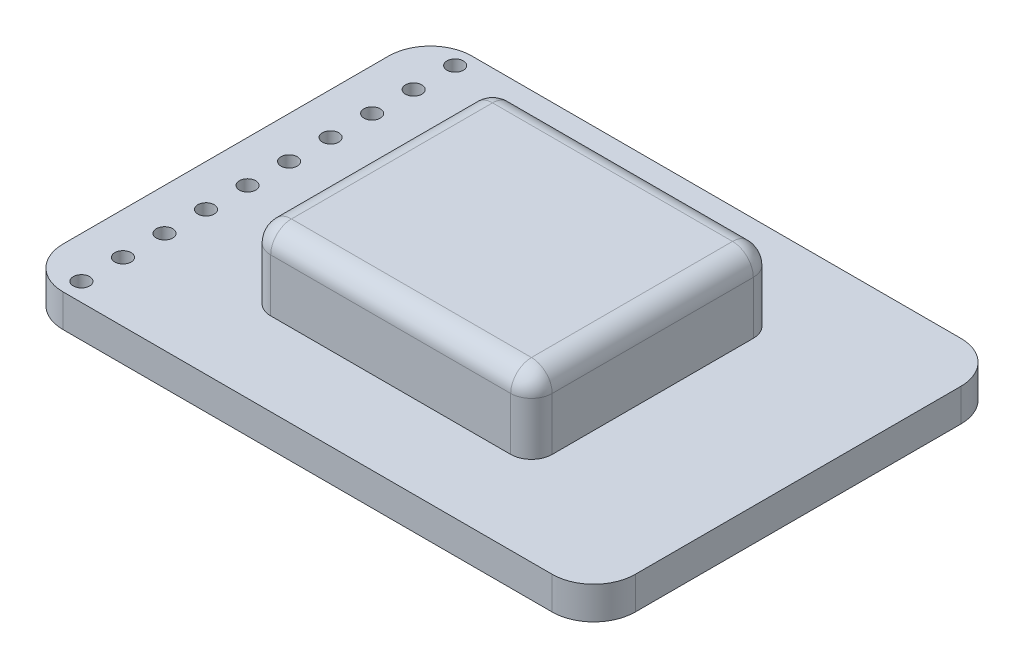
ISO-10303-21;
HEADER;
FILE_DESCRIPTION(('STEP AP214'),'2;1');
FILE_NAME('part.step','',(''),(''),'','','');
FILE_SCHEMA(('AUTOMOTIVE_DESIGN { 1 0 10303 214 1 1 1 1 }'));
ENDSEC;
DATA;
#1=APPLICATION_CONTEXT('core data for automotive mechanical design processes');
#2=APPLICATION_PROTOCOL_DEFINITION('international standard','automotive_design',2000,#1);
#3=PRODUCT_CONTEXT('',#1,'mechanical');
#4=PRODUCT('Part','Part','',(#3));
#5=PRODUCT_RELATED_PRODUCT_CATEGORY('part','',(#4));
#6=PRODUCT_DEFINITION_FORMATION('','',#4);
#7=PRODUCT_DEFINITION_CONTEXT('part definition',#1,'design');
#8=PRODUCT_DEFINITION('design','',#6,#7);
#9=PRODUCT_DEFINITION_SHAPE('','',#8);
#10=(LENGTH_UNIT() NAMED_UNIT(*) SI_UNIT(.MILLI.,.METRE.));
#11=(NAMED_UNIT(*) PLANE_ANGLE_UNIT() SI_UNIT($,.RADIAN.));
#12=(NAMED_UNIT(*) SI_UNIT($,.STERADIAN.) SOLID_ANGLE_UNIT());
#13=UNCERTAINTY_MEASURE_WITH_UNIT(LENGTH_MEASURE(1.E-05),#10,'distance_accuracy_value','');
#14=(GEOMETRIC_REPRESENTATION_CONTEXT(3) GLOBAL_UNCERTAINTY_ASSIGNED_CONTEXT((#13)) GLOBAL_UNIT_ASSIGNED_CONTEXT((#10,
#11,#12)) REPRESENTATION_CONTEXT('',''));
#15=CARTESIAN_POINT('',(0.,0.,0.));
#16=DIRECTION('',(0.,0.,1.));
#17=DIRECTION('',(1.,0.,0.));
#18=AXIS2_PLACEMENT_3D('',#15,#16,#17);
#19=CARTESIAN_POINT('',(0.,2.,0.));
#20=DIRECTION('',(0.,-1.,0.));
#21=DIRECTION('',(0.,0.,-1.));
#22=AXIS2_PLACEMENT_3D('',#19,#20,#21);
#23=PLANE('',#22);
#24=CARTESIAN_POINT('',(2.54000000000024,2.,-1.124));
#25=DIRECTION('',(0.,1.,0.));
#26=DIRECTION('',(0.,0.,1.));
#27=AXIS2_PLACEMENT_3D('',#24,#25,#26);
#28=CIRCLE('',#27,0.5);
#29=CARTESIAN_POINT('',(2.54000000000024,2.,-0.624));
#30=VERTEX_POINT('',#29);
#31=EDGE_CURVE('E349',#30,#30,#28,.T.);
#32=ORIENTED_EDGE('',*,*,#31,.F.);
#33=EDGE_LOOP('',(#32));
#34=FACE_BOUND('',#33,.T.);
#35=CARTESIAN_POINT('',(2.54000000000021,2.,-3.664));
#36=DIRECTION('',(0.,1.,0.));
#37=DIRECTION('',(0.,0.,1.));
#38=AXIS2_PLACEMENT_3D('',#35,#36,#37);
#39=CIRCLE('',#38,0.5);
#40=CARTESIAN_POINT('',(2.54000000000021,2.,-3.164));
#41=VERTEX_POINT('',#40);
#42=EDGE_CURVE('E339',#41,#41,#39,.T.);
#43=ORIENTED_EDGE('',*,*,#42,.F.);
#44=EDGE_LOOP('',(#43));
#45=FACE_BOUND('',#44,.T.);
#46=CARTESIAN_POINT('',(2.54000000000019,2.,-6.204));
#47=DIRECTION('',(0.,1.,0.));
#48=DIRECTION('',(0.,0.,1.));
#49=AXIS2_PLACEMENT_3D('',#46,#47,#48);
#50=CIRCLE('',#49,0.5);
#51=CARTESIAN_POINT('',(2.54000000000019,2.,-5.704));
#52=VERTEX_POINT('',#51);
#53=EDGE_CURVE('E336',#52,#52,#50,.T.);
#54=ORIENTED_EDGE('',*,*,#53,.F.);
#55=EDGE_LOOP('',(#54));
#56=FACE_BOUND('',#55,.T.);
#57=CARTESIAN_POINT('',(2.54000000000016,2.,-8.744));
#58=DIRECTION('',(0.,1.,0.));
#59=DIRECTION('',(0.,0.,1.));
#60=AXIS2_PLACEMENT_3D('',#57,#58,#59);
#61=CIRCLE('',#60,0.5);
#62=CARTESIAN_POINT('',(2.54000000000016,2.,-8.244));
#63=VERTEX_POINT('',#62);
#64=EDGE_CURVE('E333',#63,#63,#61,.T.);
#65=ORIENTED_EDGE('',*,*,#64,.F.);
#66=EDGE_LOOP('',(#65));
#67=FACE_BOUND('',#66,.T.);
#68=CARTESIAN_POINT('',(2.54000000000013,2.,-11.284));
#69=DIRECTION('',(0.,1.,0.));
#70=DIRECTION('',(0.,0.,1.));
#71=AXIS2_PLACEMENT_3D('',#68,#69,#70);
#72=CIRCLE('',#71,0.5);
#73=CARTESIAN_POINT('',(2.54000000000013,2.,-10.784));
#74=VERTEX_POINT('',#73);
#75=EDGE_CURVE('E329',#74,#74,#72,.T.);
#76=ORIENTED_EDGE('',*,*,#75,.F.);
#77=EDGE_LOOP('',(#76));
#78=FACE_BOUND('',#77,.T.);
#79=CARTESIAN_POINT('',(2.54000000000011,2.,-13.824));
#80=DIRECTION('',(0.,1.,0.));
#81=DIRECTION('',(0.,0.,1.));
#82=AXIS2_PLACEMENT_3D('',#79,#80,#81);
#83=CIRCLE('',#82,0.5);
#84=CARTESIAN_POINT('',(2.54000000000011,2.,-13.324));
#85=VERTEX_POINT('',#84);
#86=EDGE_CURVE('E325',#85,#85,#83,.T.);
#87=ORIENTED_EDGE('',*,*,#86,.F.);
#88=EDGE_LOOP('',(#87));
#89=FACE_BOUND('',#88,.T.);
#90=CARTESIAN_POINT('',(2.54000000000008,2.,-16.364));
#91=DIRECTION('',(0.,1.,0.));
#92=DIRECTION('',(0.,0.,1.));
#93=AXIS2_PLACEMENT_3D('',#90,#91,#92);
#94=CIRCLE('',#93,0.5);
#95=CARTESIAN_POINT('',(2.54000000000008,2.,-15.864));
#96=VERTEX_POINT('',#95);
#97=EDGE_CURVE('E321',#96,#96,#94,.T.);
#98=ORIENTED_EDGE('',*,*,#97,.F.);
#99=EDGE_LOOP('',(#98));
#100=FACE_BOUND('',#99,.T.);
#101=CARTESIAN_POINT('',(2.54000000000005,2.,-18.904));
#102=DIRECTION('',(0.,1.,0.));
#103=DIRECTION('',(0.,0.,1.));
#104=AXIS2_PLACEMENT_3D('',#101,#102,#103);
#105=CIRCLE('',#104,0.5);
#106=CARTESIAN_POINT('',(2.54000000000005,2.,-18.404));
#107=VERTEX_POINT('',#106);
#108=EDGE_CURVE('E317',#107,#107,#105,.T.);
#109=ORIENTED_EDGE('',*,*,#108,.F.);
#110=EDGE_LOOP('',(#109));
#111=FACE_BOUND('',#110,.T.);
#112=CARTESIAN_POINT('',(2.54000000000003,2.,-21.444));
#113=DIRECTION('',(0.,1.,0.));
#114=DIRECTION('',(0.,0.,1.));
#115=AXIS2_PLACEMENT_3D('',#112,#113,#114);
#116=CIRCLE('',#115,0.5);
#117=CARTESIAN_POINT('',(2.54000000000003,2.,-20.944));
#118=VERTEX_POINT('',#117);
#119=EDGE_CURVE('E313',#118,#118,#116,.T.);
#120=ORIENTED_EDGE('',*,*,#119,.F.);
#121=EDGE_LOOP('',(#120));
#122=FACE_BOUND('',#121,.T.);
#123=CARTESIAN_POINT('',(2.54,2.,-23.984));
#124=DIRECTION('',(0.,1.,0.));
#125=DIRECTION('',(0.,0.,1.));
#126=AXIS2_PLACEMENT_3D('',#123,#124,#125);
#127=CIRCLE('',#126,0.5);
#128=CARTESIAN_POINT('',(2.54,2.,-23.484));
#129=VERTEX_POINT('',#128);
#130=EDGE_CURVE('E309',#129,#129,#127,.T.);
#131=ORIENTED_EDGE('',*,*,#130,.F.);
#132=EDGE_LOOP('',(#131));
#133=FACE_BOUND('',#132,.T.);
#134=DIRECTION('',(-1.,0.,0.));
#135=VECTOR('',#134,1.);
#136=CARTESIAN_POINT('',(0.,2.,-25.));
#137=LINE('',#136,#135);
#138=CARTESIAN_POINT('',(32.460000104,2.,-25.));
#139=VERTEX_POINT('',#138);
#140=CARTESIAN_POINT('',(2.54,2.,-25.));
#141=VERTEX_POINT('',#140);
#142=EDGE_CURVE('E202',#139,#141,#137,.T.);
#143=ORIENTED_EDGE('',*,*,#142,.T.);
#144=CARTESIAN_POINT('',(2.54,2.,-22.46));
#145=DIRECTION('',(0.,-1.,0.));
#146=DIRECTION('',(0.,0.,-1.));
#147=AXIS2_PLACEMENT_3D('',#144,#145,#146);
#148=CIRCLE('',#147,2.54);
#149=CARTESIAN_POINT('',(0.,2.,-22.46));
#150=VERTEX_POINT('',#149);
#151=EDGE_CURVE('E223',#141,#150,#148,.F.);
#152=ORIENTED_EDGE('',*,*,#151,.T.);
#153=DIRECTION('',(0.,0.,1.));
#154=VECTOR('',#153,1.);
#155=CARTESIAN_POINT('',(0.,2.,0.));
#156=LINE('',#155,#154);
#157=CARTESIAN_POINT('',(0.,2.,-2.54));
#158=VERTEX_POINT('',#157);
#159=EDGE_CURVE('E186',#150,#158,#156,.T.);
#160=ORIENTED_EDGE('',*,*,#159,.T.);
#161=CARTESIAN_POINT('',(2.54,2.,-2.54));
#162=DIRECTION('',(0.,-1.,0.));
#163=DIRECTION('',(0.,0.,-1.));
#164=AXIS2_PLACEMENT_3D('',#161,#162,#163);
#165=CIRCLE('',#164,2.54);
#166=CARTESIAN_POINT('',(2.54,2.,0.));
#167=VERTEX_POINT('',#166);
#168=EDGE_CURVE('E217',#158,#167,#165,.F.);
#169=ORIENTED_EDGE('',*,*,#168,.T.);
#170=DIRECTION('',(1.,0.,0.));
#171=VECTOR('',#170,1.);
#172=CARTESIAN_POINT('',(0.,2.,0.));
#173=LINE('',#172,#171);
#174=CARTESIAN_POINT('',(32.460000104,2.,0.));
#175=VERTEX_POINT('',#174);
#176=EDGE_CURVE('E374',#167,#175,#173,.T.);
#177=ORIENTED_EDGE('',*,*,#176,.T.);
#178=CARTESIAN_POINT('',(32.460000104,2.,-2.54));
#179=DIRECTION('',(0.,-1.,0.));
#180=DIRECTION('',(0.,0.,-1.));
#181=AXIS2_PLACEMENT_3D('',#178,#179,#180);
#182=CIRCLE('',#181,2.54);
#183=CARTESIAN_POINT('',(35.000000104,2.,-2.54));
#184=VERTEX_POINT('',#183);
#185=EDGE_CURVE('E219',#175,#184,#182,.F.);
#186=ORIENTED_EDGE('',*,*,#185,.T.);
#187=DIRECTION('',(0.,0.,-1.));
#188=VECTOR('',#187,1.);
#189=CARTESIAN_POINT('',(35.000000104,2.,0.));
#190=LINE('',#189,#188);
#191=CARTESIAN_POINT('',(35.000000104,2.,-22.46));
#192=VERTEX_POINT('',#191);
#193=EDGE_CURVE('E376',#184,#192,#190,.T.);
#194=ORIENTED_EDGE('',*,*,#193,.T.);
#195=CARTESIAN_POINT('',(32.460000104,2.,-22.46));
#196=DIRECTION('',(0.,-1.,0.));
#197=DIRECTION('',(0.,0.,-1.));
#198=AXIS2_PLACEMENT_3D('',#195,#196,#197);
#199=CIRCLE('',#198,2.54);
#200=EDGE_CURVE('E221',#192,#139,#199,.F.);
#201=ORIENTED_EDGE('',*,*,#200,.T.);
#202=EDGE_LOOP('',(#143,#152,#160,#169,#177,#186,#194,#201));
#203=FACE_BOUND('',#202,.T.);
#204=DIRECTION('',(0.,0.,1.));
#205=VECTOR('',#204,1.);
#206=CARTESIAN_POINT('',(8.89,2.,-19.92));
#207=LINE('',#206,#205);
#208=CARTESIAN_POINT('',(8.89,2.,-18.65));
#209=VERTEX_POINT('',#208);
#210=CARTESIAN_POINT('',(8.89,2.,-6.35));
#211=VERTEX_POINT('',#210);
#212=EDGE_CURVE('E306',#209,#211,#207,.T.);
#213=ORIENTED_EDGE('',*,*,#212,.F.);
#214=CARTESIAN_POINT('',(10.16,2.,-18.65));
#215=DIRECTION('',(0.,-1.,0.));
#216=DIRECTION('',(0.,0.,-1.));
#217=AXIS2_PLACEMENT_3D('',#214,#215,#216);
#218=CIRCLE('',#217,1.27);
#219=CARTESIAN_POINT('',(10.16,2.,-19.92));
#220=VERTEX_POINT('',#219);
#221=EDGE_CURVE('E269',#209,#220,#218,.T.);
#222=ORIENTED_EDGE('',*,*,#221,.T.);
#223=DIRECTION('',(-1.,0.,0.));
#224=VECTOR('',#223,1.);
#225=CARTESIAN_POINT('',(8.89,2.,-19.92));
#226=LINE('',#225,#224);
#227=CARTESIAN_POINT('',(24.840000104,2.,-19.92));
#228=VERTEX_POINT('',#227);
#229=EDGE_CURVE('E193',#228,#220,#226,.T.);
#230=ORIENTED_EDGE('',*,*,#229,.F.);
#231=CARTESIAN_POINT('',(24.840000104,2.,-18.65));
#232=DIRECTION('',(0.,-1.,0.));
#233=DIRECTION('',(0.,0.,-1.));
#234=AXIS2_PLACEMENT_3D('',#231,#232,#233);
#235=CIRCLE('',#234,1.27);
#236=CARTESIAN_POINT('',(26.110000104,2.,-18.65));
#237=VERTEX_POINT('',#236);
#238=EDGE_CURVE('E267',#228,#237,#235,.T.);
#239=ORIENTED_EDGE('',*,*,#238,.T.);
#240=DIRECTION('',(0.,0.,-1.));
#241=VECTOR('',#240,1.);
#242=CARTESIAN_POINT('',(26.110000104,2.,-19.92));
#243=LINE('',#242,#241);
#244=CARTESIAN_POINT('',(26.110000104,2.,-6.35));
#245=VERTEX_POINT('',#244);
#246=EDGE_CURVE('E199',#245,#237,#243,.T.);
#247=ORIENTED_EDGE('',*,*,#246,.F.);
#248=CARTESIAN_POINT('',(24.840000104,2.,-6.35));
#249=DIRECTION('',(0.,-1.,0.));
#250=DIRECTION('',(0.,0.,-1.));
#251=AXIS2_PLACEMENT_3D('',#248,#249,#250);
#252=CIRCLE('',#251,1.27);
#253=CARTESIAN_POINT('',(24.840000104,2.,-5.08));
#254=VERTEX_POINT('',#253);
#255=EDGE_CURVE('E11',#245,#254,#252,.T.);
#256=ORIENTED_EDGE('',*,*,#255,.T.);
#257=DIRECTION('',(1.,0.,0.));
#258=VECTOR('',#257,1.);
#259=CARTESIAN_POINT('',(8.89,2.,-5.08));
#260=LINE('',#259,#258);
#261=CARTESIAN_POINT('',(10.16,2.,-5.08));
#262=VERTEX_POINT('',#261);
#263=EDGE_CURVE('E368',#262,#254,#260,.T.);
#264=ORIENTED_EDGE('',*,*,#263,.F.);
#265=CARTESIAN_POINT('',(10.16,2.,-6.35));
#266=DIRECTION('',(0.,-1.,0.));
#267=DIRECTION('',(0.,0.,-1.));
#268=AXIS2_PLACEMENT_3D('',#265,#266,#267);
#269=CIRCLE('',#268,1.27);
#270=EDGE_CURVE('E47',#262,#211,#269,.T.);
#271=ORIENTED_EDGE('',*,*,#270,.T.);
#272=EDGE_LOOP('',(#213,#222,#230,#239,#247,#256,#264,#271));
#273=FACE_BOUND('',#272,.T.);
#274=ADVANCED_FACE('F38',(#34,#45,#56,#67,#78,#89,#100,#111,#122,#133,#203,#273),#23,.F.);
#275=CARTESIAN_POINT('',(0.,2.,0.));
#276=DIRECTION('',(1.,0.,0.));
#277=DIRECTION('',(0.,0.,-1.));
#278=AXIS2_PLACEMENT_3D('',#275,#276,#277);
#279=PLANE('',#278);
#280=ORIENTED_EDGE('',*,*,#159,.F.);
#281=DIRECTION('',(0.,-1.,0.));
#282=VECTOR('',#281,1.);
#283=CARTESIAN_POINT('',(0.,2.,-22.46));
#284=LINE('',#283,#282);
#285=CARTESIAN_POINT('',(0.,0.,-22.46));
#286=VERTEX_POINT('',#285);
#287=EDGE_CURVE('E170',#150,#286,#284,.T.);
#288=ORIENTED_EDGE('',*,*,#287,.T.);
#289=DIRECTION('',(0.,0.,1.));
#290=VECTOR('',#289,1.);
#291=CARTESIAN_POINT('',(0.,0.,0.));
#292=LINE('',#291,#290);
#293=CARTESIAN_POINT('',(0.,0.,-2.54));
#294=VERTEX_POINT('',#293);
#295=EDGE_CURVE('E183',#286,#294,#292,.T.);
#296=ORIENTED_EDGE('',*,*,#295,.T.);
#297=DIRECTION('',(0.,-1.,0.));
#298=VECTOR('',#297,1.);
#299=CARTESIAN_POINT('',(0.,2.,-2.54));
#300=LINE('',#299,#298);
#301=EDGE_CURVE('E188',#294,#158,#300,.F.);
#302=ORIENTED_EDGE('',*,*,#301,.T.);
#303=EDGE_LOOP('',(#280,#288,#296,#302));
#304=FACE_BOUND('',#303,.T.);
#305=ADVANCED_FACE('F182',(#304),#279,.F.);
#306=CARTESIAN_POINT('',(0.,2.,0.));
#307=DIRECTION('',(0.,0.,-1.));
#308=DIRECTION('',(-1.,0.,0.));
#309=AXIS2_PLACEMENT_3D('',#306,#307,#308);
#310=PLANE('',#309);
#311=DIRECTION('',(1.,0.,0.));
#312=VECTOR('',#311,1.);
#313=CARTESIAN_POINT('',(0.,0.,0.));
#314=LINE('',#313,#312);
#315=CARTESIAN_POINT('',(2.54,0.,0.));
#316=VERTEX_POINT('',#315);
#317=CARTESIAN_POINT('',(32.460000104,0.,0.));
#318=VERTEX_POINT('',#317);
#319=EDGE_CURVE('E192',#316,#318,#314,.T.);
#320=ORIENTED_EDGE('',*,*,#319,.T.);
#321=DIRECTION('',(0.,-1.,0.));
#322=VECTOR('',#321,1.);
#323=CARTESIAN_POINT('',(32.460000104,2.,0.));
#324=LINE('',#323,#322);
#325=EDGE_CURVE('E233',#318,#175,#324,.F.);
#326=ORIENTED_EDGE('',*,*,#325,.T.);
#327=ORIENTED_EDGE('',*,*,#176,.F.);
#328=DIRECTION('',(0.,-1.,0.));
#329=VECTOR('',#328,1.);
#330=CARTESIAN_POINT('',(2.54,2.,0.));
#331=LINE('',#330,#329);
#332=EDGE_CURVE('E230',#167,#316,#331,.T.);
#333=ORIENTED_EDGE('',*,*,#332,.T.);
#334=EDGE_LOOP('',(#320,#326,#327,#333));
#335=FACE_BOUND('',#334,.T.);
#336=ADVANCED_FACE('F399',(#335),#310,.F.);
#337=CARTESIAN_POINT('',(35.000000104,2.,0.));
#338=DIRECTION('',(-1.,0.,0.));
#339=DIRECTION('',(0.,0.,1.));
#340=AXIS2_PLACEMENT_3D('',#337,#338,#339);
#341=PLANE('',#340);
#342=DIRECTION('',(0.,0.,-1.));
#343=VECTOR('',#342,1.);
#344=CARTESIAN_POINT('',(35.000000104,0.,0.));
#345=LINE('',#344,#343);
#346=CARTESIAN_POINT('',(35.000000104,0.,-2.54));
#347=VERTEX_POINT('',#346);
#348=CARTESIAN_POINT('',(35.000000104,0.,-22.46));
#349=VERTEX_POINT('',#348);
#350=EDGE_CURVE('E196',#347,#349,#345,.T.);
#351=ORIENTED_EDGE('',*,*,#350,.T.);
#352=DIRECTION('',(0.,-1.,0.));
#353=VECTOR('',#352,1.);
#354=CARTESIAN_POINT('',(35.000000104,2.,-22.46));
#355=LINE('',#354,#353);
#356=EDGE_CURVE('E228',#349,#192,#355,.F.);
#357=ORIENTED_EDGE('',*,*,#356,.T.);
#358=ORIENTED_EDGE('',*,*,#193,.F.);
#359=DIRECTION('',(0.,-1.,0.));
#360=VECTOR('',#359,1.);
#361=CARTESIAN_POINT('',(35.000000104,2.,-2.54));
#362=LINE('',#361,#360);
#363=EDGE_CURVE('E225',#184,#347,#362,.T.);
#364=ORIENTED_EDGE('',*,*,#363,.T.);
#365=EDGE_LOOP('',(#351,#357,#358,#364));
#366=FACE_BOUND('',#365,.T.);
#367=ADVANCED_FACE('F392',(#366),#341,.F.);
#368=CARTESIAN_POINT('',(0.,2.,-25.));
#369=DIRECTION('',(0.,0.,1.));
#370=DIRECTION('',(1.,0.,0.));
#371=AXIS2_PLACEMENT_3D('',#368,#369,#370);
#372=PLANE('',#371);
#373=DIRECTION('',(-1.,0.,0.));
#374=VECTOR('',#373,1.);
#375=CARTESIAN_POINT('',(0.,0.,-25.));
#376=LINE('',#375,#374);
#377=CARTESIAN_POINT('',(32.460000104,0.,-25.));
#378=VERTEX_POINT('',#377);
#379=CARTESIAN_POINT('',(2.54,0.,-25.));
#380=VERTEX_POINT('',#379);
#381=EDGE_CURVE('E207',#378,#380,#376,.T.);
#382=ORIENTED_EDGE('',*,*,#381,.T.);
#383=DIRECTION('',(0.,-1.,0.));
#384=VECTOR('',#383,1.);
#385=CARTESIAN_POINT('',(2.54,2.,-25.));
#386=LINE('',#385,#384);
#387=EDGE_CURVE('E171',#380,#141,#386,.F.);
#388=ORIENTED_EDGE('',*,*,#387,.T.);
#389=ORIENTED_EDGE('',*,*,#142,.F.);
#390=DIRECTION('',(0.,-1.,0.));
#391=VECTOR('',#390,1.);
#392=CARTESIAN_POINT('',(32.460000104,2.,-25.));
#393=LINE('',#392,#391);
#394=EDGE_CURVE('E176',#139,#378,#393,.T.);
#395=ORIENTED_EDGE('',*,*,#394,.T.);
#396=EDGE_LOOP('',(#382,#388,#389,#395));
#397=FACE_BOUND('',#396,.T.);
#398=ADVANCED_FACE('F386',(#397),#372,.F.);
#399=CARTESIAN_POINT('',(0.,0.,0.));
#400=DIRECTION('',(0.,-1.,0.));
#401=DIRECTION('',(0.,0.,-1.));
#402=AXIS2_PLACEMENT_3D('',#399,#400,#401);
#403=PLANE('',#402);
#404=CARTESIAN_POINT('',(2.54000000000024,0.,-1.124));
#405=DIRECTION('',(0.,-1.,0.));
#406=DIRECTION('',(0.,0.,-1.));
#407=AXIS2_PLACEMENT_3D('',#404,#405,#406);
#408=CIRCLE('',#407,0.5);
#409=CARTESIAN_POINT('',(2.54000000000024,0.,-1.624));
#410=VERTEX_POINT('',#409);
#411=EDGE_CURVE('E42',#410,#410,#408,.T.);
#412=ORIENTED_EDGE('',*,*,#411,.F.);
#413=EDGE_LOOP('',(#412));
#414=FACE_BOUND('',#413,.T.);
#415=CARTESIAN_POINT('',(2.54000000000021,0.,-3.664));
#416=DIRECTION('',(0.,-1.,0.));
#417=DIRECTION('',(0.,0.,-1.));
#418=AXIS2_PLACEMENT_3D('',#415,#416,#417);
#419=CIRCLE('',#418,0.5);
#420=CARTESIAN_POINT('',(2.54000000000021,0.,-4.164));
#421=VERTEX_POINT('',#420);
#422=EDGE_CURVE('E337',#421,#421,#419,.T.);
#423=ORIENTED_EDGE('',*,*,#422,.F.);
#424=EDGE_LOOP('',(#423));
#425=FACE_BOUND('',#424,.T.);
#426=CARTESIAN_POINT('',(2.54000000000019,0.,-6.204));
#427=DIRECTION('',(0.,-1.,0.));
#428=DIRECTION('',(0.,0.,-1.));
#429=AXIS2_PLACEMENT_3D('',#426,#427,#428);
#430=CIRCLE('',#429,0.5);
#431=CARTESIAN_POINT('',(2.54000000000019,0.,-6.704));
#432=VERTEX_POINT('',#431);
#433=EDGE_CURVE('E334',#432,#432,#430,.T.);
#434=ORIENTED_EDGE('',*,*,#433,.F.);
#435=EDGE_LOOP('',(#434));
#436=FACE_BOUND('',#435,.T.);
#437=CARTESIAN_POINT('',(2.54000000000016,0.,-8.744));
#438=DIRECTION('',(0.,-1.,0.));
#439=DIRECTION('',(0.,0.,-1.));
#440=AXIS2_PLACEMENT_3D('',#437,#438,#439);
#441=CIRCLE('',#440,0.5);
#442=CARTESIAN_POINT('',(2.54000000000016,0.,-9.244));
#443=VERTEX_POINT('',#442);
#444=EDGE_CURVE('E330',#443,#443,#441,.T.);
#445=ORIENTED_EDGE('',*,*,#444,.F.);
#446=EDGE_LOOP('',(#445));
#447=FACE_BOUND('',#446,.T.);
#448=CARTESIAN_POINT('',(2.54000000000013,0.,-11.284));
#449=DIRECTION('',(0.,-1.,0.));
#450=DIRECTION('',(0.,0.,-1.));
#451=AXIS2_PLACEMENT_3D('',#448,#449,#450);
#452=CIRCLE('',#451,0.5);
#453=CARTESIAN_POINT('',(2.54000000000013,0.,-11.784));
#454=VERTEX_POINT('',#453);
#455=EDGE_CURVE('E326',#454,#454,#452,.T.);
#456=ORIENTED_EDGE('',*,*,#455,.F.);
#457=EDGE_LOOP('',(#456));
#458=FACE_BOUND('',#457,.T.);
#459=CARTESIAN_POINT('',(2.54000000000011,0.,-13.824));
#460=DIRECTION('',(0.,-1.,0.));
#461=DIRECTION('',(0.,0.,-1.));
#462=AXIS2_PLACEMENT_3D('',#459,#460,#461);
#463=CIRCLE('',#462,0.5);
#464=CARTESIAN_POINT('',(2.54000000000011,0.,-14.324));
#465=VERTEX_POINT('',#464);
#466=EDGE_CURVE('E322',#465,#465,#463,.T.);
#467=ORIENTED_EDGE('',*,*,#466,.F.);
#468=EDGE_LOOP('',(#467));
#469=FACE_BOUND('',#468,.T.);
#470=CARTESIAN_POINT('',(2.54000000000008,0.,-16.364));
#471=DIRECTION('',(0.,-1.,0.));
#472=DIRECTION('',(0.,0.,-1.));
#473=AXIS2_PLACEMENT_3D('',#470,#471,#472);
#474=CIRCLE('',#473,0.5);
#475=CARTESIAN_POINT('',(2.54000000000008,0.,-16.864));
#476=VERTEX_POINT('',#475);
#477=EDGE_CURVE('E318',#476,#476,#474,.T.);
#478=ORIENTED_EDGE('',*,*,#477,.F.);
#479=EDGE_LOOP('',(#478));
#480=FACE_BOUND('',#479,.T.);
#481=CARTESIAN_POINT('',(2.54000000000005,0.,-18.904));
#482=DIRECTION('',(0.,-1.,0.));
#483=DIRECTION('',(0.,0.,-1.));
#484=AXIS2_PLACEMENT_3D('',#481,#482,#483);
#485=CIRCLE('',#484,0.5);
#486=CARTESIAN_POINT('',(2.54000000000005,0.,-19.404));
#487=VERTEX_POINT('',#486);
#488=EDGE_CURVE('E314',#487,#487,#485,.T.);
#489=ORIENTED_EDGE('',*,*,#488,.F.);
#490=EDGE_LOOP('',(#489));
#491=FACE_BOUND('',#490,.T.);
#492=CARTESIAN_POINT('',(2.54000000000003,0.,-21.444));
#493=DIRECTION('',(0.,-1.,0.));
#494=DIRECTION('',(0.,0.,-1.));
#495=AXIS2_PLACEMENT_3D('',#492,#493,#494);
#496=CIRCLE('',#495,0.5);
#497=CARTESIAN_POINT('',(2.54000000000003,0.,-21.944));
#498=VERTEX_POINT('',#497);
#499=EDGE_CURVE('E310',#498,#498,#496,.T.);
#500=ORIENTED_EDGE('',*,*,#499,.F.);
#501=EDGE_LOOP('',(#500));
#502=FACE_BOUND('',#501,.T.);
#503=CARTESIAN_POINT('',(2.54,0.,-23.984));
#504=DIRECTION('',(0.,-1.,0.));
#505=DIRECTION('',(0.,0.,-1.));
#506=AXIS2_PLACEMENT_3D('',#503,#504,#505);
#507=CIRCLE('',#506,0.5);
#508=CARTESIAN_POINT('',(2.54,0.,-24.484));
#509=VERTEX_POINT('',#508);
#510=EDGE_CURVE('E276',#509,#509,#507,.T.);
#511=ORIENTED_EDGE('',*,*,#510,.F.);
#512=EDGE_LOOP('',(#511));
#513=FACE_BOUND('',#512,.T.);
#514=ORIENTED_EDGE('',*,*,#295,.F.);
#515=CARTESIAN_POINT('',(2.54,0.,-22.46));
#516=DIRECTION('',(0.,-1.,0.));
#517=DIRECTION('',(0.,0.,-1.));
#518=AXIS2_PLACEMENT_3D('',#515,#516,#517);
#519=CIRCLE('',#518,2.54);
#520=EDGE_CURVE('E166',#286,#380,#519,.T.);
#521=ORIENTED_EDGE('',*,*,#520,.T.);
#522=ORIENTED_EDGE('',*,*,#381,.F.);
#523=CARTESIAN_POINT('',(32.460000104,0.,-22.46));
#524=DIRECTION('',(0.,-1.,0.));
#525=DIRECTION('',(0.,0.,-1.));
#526=AXIS2_PLACEMENT_3D('',#523,#524,#525);
#527=CIRCLE('',#526,2.54);
#528=EDGE_CURVE('E177',#378,#349,#527,.T.);
#529=ORIENTED_EDGE('',*,*,#528,.T.);
#530=ORIENTED_EDGE('',*,*,#350,.F.);
#531=CARTESIAN_POINT('',(32.460000104,0.,-2.54));
#532=DIRECTION('',(0.,-1.,0.));
#533=DIRECTION('',(0.,0.,-1.));
#534=AXIS2_PLACEMENT_3D('',#531,#532,#533);
#535=CIRCLE('',#534,2.54);
#536=EDGE_CURVE('E211',#347,#318,#535,.T.);
#537=ORIENTED_EDGE('',*,*,#536,.T.);
#538=ORIENTED_EDGE('',*,*,#319,.F.);
#539=CARTESIAN_POINT('',(2.54,0.,-2.54));
#540=DIRECTION('',(0.,-1.,0.));
#541=DIRECTION('',(0.,0.,-1.));
#542=AXIS2_PLACEMENT_3D('',#539,#540,#541);
#543=CIRCLE('',#542,2.54);
#544=EDGE_CURVE('E187',#316,#294,#543,.T.);
#545=ORIENTED_EDGE('',*,*,#544,.T.);
#546=EDGE_LOOP('',(#514,#521,#522,#529,#530,#537,#538,#545));
#547=FACE_BOUND('',#546,.T.);
#548=ADVANCED_FACE('F190',(#414,#425,#436,#447,#458,#469,#480,#491,#502,#513,#547),#403,.T.);
#549=CARTESIAN_POINT('',(2.54,2.,-22.46));
#550=DIRECTION('',(0.,-1.,0.));
#551=DIRECTION('',(0.,0.,-1.));
#552=AXIS2_PLACEMENT_3D('',#549,#550,#551);
#553=CYLINDRICAL_SURFACE('',#552,2.54);
#554=ORIENTED_EDGE('',*,*,#151,.F.);
#555=ORIENTED_EDGE('',*,*,#387,.F.);
#556=ORIENTED_EDGE('',*,*,#520,.F.);
#557=ORIENTED_EDGE('',*,*,#287,.F.);
#558=EDGE_LOOP('',(#554,#555,#556,#557));
#559=FACE_BOUND('',#558,.T.);
#560=ADVANCED_FACE('F169',(#559),#553,.T.);
#561=CARTESIAN_POINT('',(32.460000104,2.,-22.46));
#562=DIRECTION('',(0.,-1.,0.));
#563=DIRECTION('',(0.,0.,-1.));
#564=AXIS2_PLACEMENT_3D('',#561,#562,#563);
#565=CYLINDRICAL_SURFACE('',#564,2.54);
#566=ORIENTED_EDGE('',*,*,#200,.F.);
#567=ORIENTED_EDGE('',*,*,#356,.F.);
#568=ORIENTED_EDGE('',*,*,#528,.F.);
#569=ORIENTED_EDGE('',*,*,#394,.F.);
#570=EDGE_LOOP('',(#566,#567,#568,#569));
#571=FACE_BOUND('',#570,.T.);
#572=ADVANCED_FACE('F388',(#571),#565,.T.);
#573=CARTESIAN_POINT('',(32.460000104,2.,-2.54));
#574=DIRECTION('',(0.,-1.,0.));
#575=DIRECTION('',(0.,0.,-1.));
#576=AXIS2_PLACEMENT_3D('',#573,#574,#575);
#577=CYLINDRICAL_SURFACE('',#576,2.54);
#578=ORIENTED_EDGE('',*,*,#185,.F.);
#579=ORIENTED_EDGE('',*,*,#325,.F.);
#580=ORIENTED_EDGE('',*,*,#536,.F.);
#581=ORIENTED_EDGE('',*,*,#363,.F.);
#582=EDGE_LOOP('',(#578,#579,#580,#581));
#583=FACE_BOUND('',#582,.T.);
#584=ADVANCED_FACE('F396',(#583),#577,.T.);
#585=CARTESIAN_POINT('',(2.54,2.,-2.54));
#586=DIRECTION('',(0.,-1.,0.));
#587=DIRECTION('',(0.,0.,-1.));
#588=AXIS2_PLACEMENT_3D('',#585,#586,#587);
#589=CYLINDRICAL_SURFACE('',#588,2.54);
#590=ORIENTED_EDGE('',*,*,#168,.F.);
#591=ORIENTED_EDGE('',*,*,#301,.F.);
#592=ORIENTED_EDGE('',*,*,#544,.F.);
#593=ORIENTED_EDGE('',*,*,#332,.F.);
#594=EDGE_LOOP('',(#590,#591,#592,#593));
#595=FACE_BOUND('',#594,.T.);
#596=ADVANCED_FACE('F404',(#595),#589,.T.);
#597=CARTESIAN_POINT('',(8.89,6.5,-19.92));
#598=DIRECTION('',(1.,0.,0.));
#599=DIRECTION('',(0.,0.,-1.));
#600=AXIS2_PLACEMENT_3D('',#597,#598,#599);
#601=PLANE('',#600);
#602=DIRECTION('',(0.,0.,1.));
#603=VECTOR('',#602,1.);
#604=CARTESIAN_POINT('',(8.89,5.23,-19.92));
#605=LINE('',#604,#603);
#606=CARTESIAN_POINT('',(8.89,5.23,-6.35));
#607=VERTEX_POINT('',#606);
#608=CARTESIAN_POINT('',(8.89,5.23,-18.65));
#609=VERTEX_POINT('',#608);
#610=EDGE_CURVE('E248',#607,#609,#605,.F.);
#611=ORIENTED_EDGE('',*,*,#610,.T.);
#612=DIRECTION('',(0.,-1.,0.));
#613=VECTOR('',#612,1.);
#614=CARTESIAN_POINT('',(8.89,6.5,-18.65));
#615=LINE('',#614,#613);
#616=EDGE_CURVE('E252',#609,#209,#615,.T.);
#617=ORIENTED_EDGE('',*,*,#616,.T.);
#618=ORIENTED_EDGE('',*,*,#212,.T.);
#619=DIRECTION('',(0.,-1.,0.));
#620=VECTOR('',#619,1.);
#621=CARTESIAN_POINT('',(8.89,6.5,-6.35));
#622=LINE('',#621,#620);
#623=EDGE_CURVE('E250',#211,#607,#622,.F.);
#624=ORIENTED_EDGE('',*,*,#623,.T.);
#625=EDGE_LOOP('',(#611,#617,#618,#624));
#626=FACE_BOUND('',#625,.T.);
#627=ADVANCED_FACE('F406',(#626),#601,.F.);
#628=CARTESIAN_POINT('',(8.89,6.5,-5.08));
#629=DIRECTION('',(0.,0.,-1.));
#630=DIRECTION('',(-1.,0.,0.));
#631=AXIS2_PLACEMENT_3D('',#628,#629,#630);
#632=PLANE('',#631);
#633=DIRECTION('',(1.,0.,0.));
#634=VECTOR('',#633,1.);
#635=CARTESIAN_POINT('',(8.89,5.23,-5.08));
#636=LINE('',#635,#634);
#637=CARTESIAN_POINT('',(24.840000104,5.23,-5.08));
#638=VERTEX_POINT('',#637);
#639=CARTESIAN_POINT('',(10.16,5.23,-5.08));
#640=VERTEX_POINT('',#639);
#641=EDGE_CURVE('E254',#638,#640,#636,.F.);
#642=ORIENTED_EDGE('',*,*,#641,.T.);
#643=DIRECTION('',(0.,-1.,0.));
#644=VECTOR('',#643,1.);
#645=CARTESIAN_POINT('',(10.16,6.5,-5.08));
#646=LINE('',#645,#644);
#647=EDGE_CURVE('E258',#640,#262,#646,.T.);
#648=ORIENTED_EDGE('',*,*,#647,.T.);
#649=ORIENTED_EDGE('',*,*,#263,.T.);
#650=DIRECTION('',(0.,-1.,0.));
#651=VECTOR('',#650,1.);
#652=CARTESIAN_POINT('',(24.840000104,6.5,-5.08));
#653=LINE('',#652,#651);
#654=EDGE_CURVE('E256',#254,#638,#653,.F.);
#655=ORIENTED_EDGE('',*,*,#654,.T.);
#656=EDGE_LOOP('',(#642,#648,#649,#655));
#657=FACE_BOUND('',#656,.T.);
#658=ADVANCED_FACE('F412',(#657),#632,.F.);
#659=CARTESIAN_POINT('',(26.110000104,6.5,-19.92));
#660=DIRECTION('',(-1.,0.,0.));
#661=DIRECTION('',(0.,0.,1.));
#662=AXIS2_PLACEMENT_3D('',#659,#660,#661);
#663=PLANE('',#662);
#664=ORIENTED_EDGE('',*,*,#246,.T.);
#665=DIRECTION('',(0.,-1.,0.));
#666=VECTOR('',#665,1.);
#667=CARTESIAN_POINT('',(26.110000104,6.5,-18.65));
#668=LINE('',#667,#666);
#669=CARTESIAN_POINT('',(26.110000104,5.23,-18.65));
#670=VERTEX_POINT('',#669);
#671=EDGE_CURVE('E246',#237,#670,#668,.F.);
#672=ORIENTED_EDGE('',*,*,#671,.T.);
#673=DIRECTION('',(0.,0.,-1.));
#674=VECTOR('',#673,1.);
#675=CARTESIAN_POINT('',(26.110000104,5.23,-5.08));
#676=LINE('',#675,#674);
#677=CARTESIAN_POINT('',(26.110000104,5.23,-6.35));
#678=VERTEX_POINT('',#677);
#679=EDGE_CURVE('E242',#670,#678,#676,.F.);
#680=ORIENTED_EDGE('',*,*,#679,.T.);
#681=DIRECTION('',(0.,-1.,0.));
#682=VECTOR('',#681,1.);
#683=CARTESIAN_POINT('',(26.110000104,6.5,-6.35));
#684=LINE('',#683,#682);
#685=EDGE_CURVE('E244',#678,#245,#684,.T.);
#686=ORIENTED_EDGE('',*,*,#685,.T.);
#687=EDGE_LOOP('',(#664,#672,#680,#686));
#688=FACE_BOUND('',#687,.T.);
#689=ADVANCED_FACE('F468',(#688),#663,.F.);
#690=CARTESIAN_POINT('',(8.89,6.5,-19.92));
#691=DIRECTION('',(0.,0.,1.));
#692=DIRECTION('',(1.,0.,0.));
#693=AXIS2_PLACEMENT_3D('',#690,#691,#692);
#694=PLANE('',#693);
#695=DIRECTION('',(-1.,0.,0.));
#696=VECTOR('',#695,1.);
#697=CARTESIAN_POINT('',(26.110000104,5.23,-19.92));
#698=LINE('',#697,#696);
#699=CARTESIAN_POINT('',(10.16,5.23,-19.92));
#700=VERTEX_POINT('',#699);
#701=CARTESIAN_POINT('',(24.840000104,5.23,-19.92));
#702=VERTEX_POINT('',#701);
#703=EDGE_CURVE('E235',#700,#702,#698,.F.);
#704=ORIENTED_EDGE('',*,*,#703,.T.);
#705=DIRECTION('',(0.,-1.,0.));
#706=VECTOR('',#705,1.);
#707=CARTESIAN_POINT('',(24.840000104,6.5,-19.92));
#708=LINE('',#707,#706);
#709=EDGE_CURVE('E239',#702,#228,#708,.T.);
#710=ORIENTED_EDGE('',*,*,#709,.T.);
#711=ORIENTED_EDGE('',*,*,#229,.T.);
#712=DIRECTION('',(0.,-1.,0.));
#713=VECTOR('',#712,1.);
#714=CARTESIAN_POINT('',(10.16,6.5,-19.92));
#715=LINE('',#714,#713);
#716=EDGE_CURVE('E237',#220,#700,#715,.F.);
#717=ORIENTED_EDGE('',*,*,#716,.T.);
#718=EDGE_LOOP('',(#704,#710,#711,#717));
#719=FACE_BOUND('',#718,.T.);
#720=ADVANCED_FACE('F477',(#719),#694,.F.);
#721=CARTESIAN_POINT('',(0.,6.5,0.));
#722=DIRECTION('',(0.,1.,0.));
#723=DIRECTION('',(0.,0.,1.));
#724=AXIS2_PLACEMENT_3D('',#721,#722,#723);
#725=PLANE('',#724);
#726=DIRECTION('',(0.,0.,-1.));
#727=VECTOR('',#726,1.);
#728=CARTESIAN_POINT('',(24.840000104,6.5,-19.92));
#729=LINE('',#728,#727);
#730=CARTESIAN_POINT('',(24.840000104,6.5,-6.35));
#731=VERTEX_POINT('',#730);
#732=CARTESIAN_POINT('',(24.840000104,6.5,-18.65));
#733=VERTEX_POINT('',#732);
#734=EDGE_CURVE('E55',#731,#733,#729,.T.);
#735=ORIENTED_EDGE('',*,*,#734,.T.);
#736=DIRECTION('',(-1.,0.,0.));
#737=VECTOR('',#736,1.);
#738=CARTESIAN_POINT('',(8.89,6.5,-18.65));
#739=LINE('',#738,#737);
#740=CARTESIAN_POINT('',(10.16,6.5,-18.65));
#741=VERTEX_POINT('',#740);
#742=EDGE_CURVE('E265',#733,#741,#739,.T.);
#743=ORIENTED_EDGE('',*,*,#742,.T.);
#744=DIRECTION('',(0.,0.,1.));
#745=VECTOR('',#744,1.);
#746=CARTESIAN_POINT('',(10.16,6.5,-5.08));
#747=LINE('',#746,#745);
#748=CARTESIAN_POINT('',(10.16,6.5,-6.35));
#749=VERTEX_POINT('',#748);
#750=EDGE_CURVE('E262',#741,#749,#747,.T.);
#751=ORIENTED_EDGE('',*,*,#750,.T.);
#752=DIRECTION('',(1.,0.,0.));
#753=VECTOR('',#752,1.);
#754=CARTESIAN_POINT('',(26.110000104,6.5,-6.35));
#755=LINE('',#754,#753);
#756=EDGE_CURVE('E260',#749,#731,#755,.T.);
#757=ORIENTED_EDGE('',*,*,#756,.T.);
#758=EDGE_LOOP('',(#735,#743,#751,#757));
#759=FACE_BOUND('',#758,.T.);
#760=ADVANCED_FACE('F487',(#759),#725,.T.);
#761=CARTESIAN_POINT('',(10.16,6.5,-6.35));
#762=DIRECTION('',(0.,-1.,0.));
#763=DIRECTION('',(0.,0.,-1.));
#764=AXIS2_PLACEMENT_3D('',#761,#762,#763);
#765=CYLINDRICAL_SURFACE('',#764,1.27);
#766=CARTESIAN_POINT('',(10.16,5.23,-6.35));
#767=DIRECTION('',(0.,1.,0.));
#768=DIRECTION('',(0.,0.,1.));
#769=AXIS2_PLACEMENT_3D('',#766,#767,#768);
#770=CIRCLE('',#769,1.27);
#771=EDGE_CURVE('E303',#607,#640,#770,.T.);
#772=ORIENTED_EDGE('',*,*,#771,.F.);
#773=ORIENTED_EDGE('',*,*,#623,.F.);
#774=ORIENTED_EDGE('',*,*,#270,.F.);
#775=ORIENTED_EDGE('',*,*,#647,.F.);
#776=EDGE_LOOP('',(#772,#773,#774,#775));
#777=FACE_BOUND('',#776,.T.);
#778=ADVANCED_FACE('F40',(#777),#765,.T.);
#779=CARTESIAN_POINT('',(10.16,5.23,-6.35));
#780=DIRECTION('',(0.,0.,1.));
#781=DIRECTION('',(1.,0.,0.));
#782=AXIS2_PLACEMENT_3D('',#779,#780,#781);
#783=SPHERICAL_SURFACE('',#782,1.27);
#784=CARTESIAN_POINT('',(10.16,5.23,-6.35));
#785=DIRECTION('',(0.,0.,1.));
#786=DIRECTION('',(1.,0.,0.));
#787=AXIS2_PLACEMENT_3D('',#784,#785,#786);
#788=CIRCLE('',#787,1.27);
#789=EDGE_CURVE('E297',#607,#749,#788,.F.);
#790=ORIENTED_EDGE('',*,*,#789,.F.);
#791=ORIENTED_EDGE('',*,*,#771,.T.);
#792=CARTESIAN_POINT('',(10.16,5.23,-6.35));
#793=DIRECTION('',(-1.,0.,0.));
#794=DIRECTION('',(0.,0.,1.));
#795=AXIS2_PLACEMENT_3D('',#792,#793,#794);
#796=CIRCLE('',#795,1.27);
#797=EDGE_CURVE('E300',#749,#640,#796,.F.);
#798=ORIENTED_EDGE('',*,*,#797,.F.);
#799=EDGE_LOOP('',(#790,#791,#798));
#800=FACE_BOUND('',#799,.T.);
#801=ADVANCED_FACE('F505',(#800),#783,.T.);
#802=CARTESIAN_POINT('',(24.840000104,6.5,-6.35));
#803=DIRECTION('',(0.,-1.,0.));
#804=DIRECTION('',(0.,0.,-1.));
#805=AXIS2_PLACEMENT_3D('',#802,#803,#804);
#806=CYLINDRICAL_SURFACE('',#805,1.27);
#807=ORIENTED_EDGE('',*,*,#255,.F.);
#808=ORIENTED_EDGE('',*,*,#685,.F.);
#809=CARTESIAN_POINT('',(24.840000104,5.23,-6.35));
#810=DIRECTION('',(0.,1.,0.));
#811=DIRECTION('',(0.,0.,1.));
#812=AXIS2_PLACEMENT_3D('',#809,#810,#811);
#813=CIRCLE('',#812,1.27);
#814=EDGE_CURVE('E294',#638,#678,#813,.T.);
#815=ORIENTED_EDGE('',*,*,#814,.F.);
#816=ORIENTED_EDGE('',*,*,#654,.F.);
#817=EDGE_LOOP('',(#807,#808,#815,#816));
#818=FACE_BOUND('',#817,.T.);
#819=ADVANCED_FACE('F514',(#818),#806,.T.);
#820=CARTESIAN_POINT('',(0.,5.23,-6.35));
#821=DIRECTION('',(-1.,0.,0.));
#822=DIRECTION('',(0.,0.,1.));
#823=AXIS2_PLACEMENT_3D('',#820,#821,#822);
#824=CYLINDRICAL_SURFACE('',#823,1.27);
#825=ORIENTED_EDGE('',*,*,#797,.T.);
#826=ORIENTED_EDGE('',*,*,#641,.F.);
#827=CARTESIAN_POINT('',(24.840000104,5.23,-6.35));
#828=DIRECTION('',(1.,0.,0.));
#829=DIRECTION('',(0.,0.,-1.));
#830=AXIS2_PLACEMENT_3D('',#827,#828,#829);
#831=CIRCLE('',#830,1.27);
#832=EDGE_CURVE('E291',#731,#638,#831,.T.);
#833=ORIENTED_EDGE('',*,*,#832,.F.);
#834=ORIENTED_EDGE('',*,*,#756,.F.);
#835=EDGE_LOOP('',(#825,#826,#833,#834));
#836=FACE_BOUND('',#835,.T.);
#837=ADVANCED_FACE('F523',(#836),#824,.T.);
#838=CARTESIAN_POINT('',(10.16,5.23,0.));
#839=DIRECTION('',(0.,0.,-1.));
#840=DIRECTION('',(-1.,0.,0.));
#841=AXIS2_PLACEMENT_3D('',#838,#839,#840);
#842=CYLINDRICAL_SURFACE('',#841,1.27);
#843=ORIENTED_EDGE('',*,*,#789,.T.);
#844=ORIENTED_EDGE('',*,*,#750,.F.);
#845=CARTESIAN_POINT('',(10.16,5.23,-18.65));
#846=DIRECTION('',(0.,0.,-1.));
#847=DIRECTION('',(-1.,0.,0.));
#848=AXIS2_PLACEMENT_3D('',#845,#846,#847);
#849=CIRCLE('',#848,1.27);
#850=EDGE_CURVE('E289',#609,#741,#849,.T.);
#851=ORIENTED_EDGE('',*,*,#850,.F.);
#852=ORIENTED_EDGE('',*,*,#610,.F.);
#853=EDGE_LOOP('',(#843,#844,#851,#852));
#854=FACE_BOUND('',#853,.T.);
#855=ADVANCED_FACE('F533',(#854),#842,.T.);
#856=CARTESIAN_POINT('',(10.16,6.5,-18.65));
#857=DIRECTION('',(0.,-1.,0.));
#858=DIRECTION('',(0.,0.,-1.));
#859=AXIS2_PLACEMENT_3D('',#856,#857,#858);
#860=CYLINDRICAL_SURFACE('',#859,1.27);
#861=ORIENTED_EDGE('',*,*,#221,.F.);
#862=ORIENTED_EDGE('',*,*,#616,.F.);
#863=CARTESIAN_POINT('',(10.16,5.23,-18.65));
#864=DIRECTION('',(0.,1.,0.));
#865=DIRECTION('',(0.,0.,1.));
#866=AXIS2_PLACEMENT_3D('',#863,#864,#865);
#867=CIRCLE('',#866,1.27);
#868=EDGE_CURVE('E286',#700,#609,#867,.T.);
#869=ORIENTED_EDGE('',*,*,#868,.F.);
#870=ORIENTED_EDGE('',*,*,#716,.F.);
#871=EDGE_LOOP('',(#861,#862,#869,#870));
#872=FACE_BOUND('',#871,.T.);
#873=ADVANCED_FACE('F543',(#872),#860,.T.);
#874=CARTESIAN_POINT('',(24.840000104,5.23,-6.35));
#875=DIRECTION('',(0.,0.,1.));
#876=DIRECTION('',(1.,0.,0.));
#877=AXIS2_PLACEMENT_3D('',#874,#875,#876);
#878=SPHERICAL_SURFACE('',#877,1.27);
#879=ORIENTED_EDGE('',*,*,#832,.T.);
#880=ORIENTED_EDGE('',*,*,#814,.T.);
#881=CARTESIAN_POINT('',(24.840000104,5.23,-6.35));
#882=DIRECTION('',(0.,0.,1.));
#883=DIRECTION('',(0.,-1.,0.));
#884=AXIS2_PLACEMENT_3D('',#881,#882,#883);
#885=CIRCLE('',#884,1.27);
#886=EDGE_CURVE('E283',#731,#678,#885,.F.);
#887=ORIENTED_EDGE('',*,*,#886,.F.);
#888=EDGE_LOOP('',(#879,#880,#887));
#889=FACE_BOUND('',#888,.T.);
#890=ADVANCED_FACE('F553',(#889),#878,.T.);
#891=CARTESIAN_POINT('',(10.16,5.23,-18.65));
#892=DIRECTION('',(0.,0.,1.));
#893=DIRECTION('',(1.,0.,0.));
#894=AXIS2_PLACEMENT_3D('',#891,#892,#893);
#895=SPHERICAL_SURFACE('',#894,1.27);
#896=ORIENTED_EDGE('',*,*,#868,.T.);
#897=ORIENTED_EDGE('',*,*,#850,.T.);
#898=CARTESIAN_POINT('',(10.16,5.23,-18.65));
#899=DIRECTION('',(-1.,0.,0.));
#900=DIRECTION('',(0.,0.,1.));
#901=AXIS2_PLACEMENT_3D('',#898,#899,#900);
#902=CIRCLE('',#901,1.27);
#903=EDGE_CURVE('E62',#700,#741,#902,.F.);
#904=ORIENTED_EDGE('',*,*,#903,.F.);
#905=EDGE_LOOP('',(#896,#897,#904));
#906=FACE_BOUND('',#905,.T.);
#907=ADVANCED_FACE('F563',(#906),#895,.T.);
#908=CARTESIAN_POINT('',(24.840000104,5.23,0.));
#909=DIRECTION('',(0.,0.,1.));
#910=DIRECTION('',(1.,0.,0.));
#911=AXIS2_PLACEMENT_3D('',#908,#909,#910);
#912=CYLINDRICAL_SURFACE('',#911,1.27);
#913=ORIENTED_EDGE('',*,*,#886,.T.);
#914=ORIENTED_EDGE('',*,*,#679,.F.);
#915=CARTESIAN_POINT('',(24.840000104,5.23,-18.65));
#916=DIRECTION('',(0.,0.,-1.));
#917=DIRECTION('',(-1.,0.,0.));
#918=AXIS2_PLACEMENT_3D('',#915,#916,#917);
#919=CIRCLE('',#918,1.27);
#920=EDGE_CURVE('E279',#733,#670,#919,.T.);
#921=ORIENTED_EDGE('',*,*,#920,.F.);
#922=ORIENTED_EDGE('',*,*,#734,.F.);
#923=EDGE_LOOP('',(#913,#914,#921,#922));
#924=FACE_BOUND('',#923,.T.);
#925=ADVANCED_FACE('F573',(#924),#912,.T.);
#926=CARTESIAN_POINT('',(0.,5.23,-18.65));
#927=DIRECTION('',(1.,0.,0.));
#928=DIRECTION('',(0.,0.,-1.));
#929=AXIS2_PLACEMENT_3D('',#926,#927,#928);
#930=CYLINDRICAL_SURFACE('',#929,1.27);
#931=ORIENTED_EDGE('',*,*,#903,.T.);
#932=ORIENTED_EDGE('',*,*,#742,.F.);
#933=CARTESIAN_POINT('',(24.840000104,5.23,-18.65));
#934=DIRECTION('',(1.,0.,0.));
#935=DIRECTION('',(0.,0.,-1.));
#936=AXIS2_PLACEMENT_3D('',#933,#934,#935);
#937=CIRCLE('',#936,1.27);
#938=EDGE_CURVE('E275',#702,#733,#937,.T.);
#939=ORIENTED_EDGE('',*,*,#938,.F.);
#940=ORIENTED_EDGE('',*,*,#703,.F.);
#941=EDGE_LOOP('',(#931,#932,#939,#940));
#942=FACE_BOUND('',#941,.T.);
#943=ADVANCED_FACE('F583',(#942),#930,.T.);
#944=CARTESIAN_POINT('',(24.840000104,5.23,-18.65));
#945=DIRECTION('',(0.,0.,1.));
#946=DIRECTION('',(1.,0.,0.));
#947=AXIS2_PLACEMENT_3D('',#944,#945,#946);
#948=SPHERICAL_SURFACE('',#947,1.27);
#949=ORIENTED_EDGE('',*,*,#938,.T.);
#950=ORIENTED_EDGE('',*,*,#920,.T.);
#951=CARTESIAN_POINT('',(24.840000104,5.23,-18.65));
#952=DIRECTION('',(0.,1.,0.));
#953=DIRECTION('',(0.,0.,1.));
#954=AXIS2_PLACEMENT_3D('',#951,#952,#953);
#955=CIRCLE('',#954,1.27);
#956=EDGE_CURVE('E272',#702,#670,#955,.F.);
#957=ORIENTED_EDGE('',*,*,#956,.F.);
#958=EDGE_LOOP('',(#949,#950,#957));
#959=FACE_BOUND('',#958,.T.);
#960=ADVANCED_FACE('F593',(#959),#948,.T.);
#961=CARTESIAN_POINT('',(24.840000104,6.5,-18.65));
#962=DIRECTION('',(0.,-1.,0.));
#963=DIRECTION('',(0.,0.,-1.));
#964=AXIS2_PLACEMENT_3D('',#961,#962,#963);
#965=CYLINDRICAL_SURFACE('',#964,1.27);
#966=ORIENTED_EDGE('',*,*,#956,.T.);
#967=ORIENTED_EDGE('',*,*,#671,.F.);
#968=ORIENTED_EDGE('',*,*,#238,.F.);
#969=ORIENTED_EDGE('',*,*,#709,.F.);
#970=EDGE_LOOP('',(#966,#967,#968,#969));
#971=FACE_BOUND('',#970,.T.);
#972=ADVANCED_FACE('F602',(#971),#965,.T.);
#973=CARTESIAN_POINT('',(2.54,-2.5,-23.984));
#974=DIRECTION('',(0.,1.,0.));
#975=DIRECTION('',(0.,0.,1.));
#976=AXIS2_PLACEMENT_3D('',#973,#974,#975);
#977=CYLINDRICAL_SURFACE('',#976,0.5);
#978=ORIENTED_EDGE('',*,*,#510,.T.);
#979=EDGE_LOOP('',(#978));
#980=FACE_BOUND('',#979,.T.);
#981=ORIENTED_EDGE('',*,*,#130,.T.);
#982=EDGE_LOOP('',(#981));
#983=FACE_BOUND('',#982,.T.);
#984=ADVANCED_FACE('F611',(#980,#983),#977,.F.);
#985=CARTESIAN_POINT('',(2.54000000000003,-2.5,-21.444));
#986=DIRECTION('',(0.,1.,0.));
#987=DIRECTION('',(0.,0.,1.));
#988=AXIS2_PLACEMENT_3D('',#985,#986,#987);
#989=CYLINDRICAL_SURFACE('',#988,0.5);
#990=ORIENTED_EDGE('',*,*,#499,.T.);
#991=EDGE_LOOP('',(#990));
#992=FACE_BOUND('',#991,.T.);
#993=ORIENTED_EDGE('',*,*,#119,.T.);
#994=EDGE_LOOP('',(#993));
#995=FACE_BOUND('',#994,.T.);
#996=ADVANCED_FACE('F632',(#992,#995),#989,.F.);
#997=CARTESIAN_POINT('',(2.54000000000005,-2.5,-18.904));
#998=DIRECTION('',(0.,1.,0.));
#999=DIRECTION('',(0.,0.,1.));
#1000=AXIS2_PLACEMENT_3D('',#997,#998,#999);
#1001=CYLINDRICAL_SURFACE('',#1000,0.5);
#1002=ORIENTED_EDGE('',*,*,#488,.T.);
#1003=EDGE_LOOP('',(#1002));
#1004=FACE_BOUND('',#1003,.T.);
#1005=ORIENTED_EDGE('',*,*,#108,.T.);
#1006=EDGE_LOOP('',(#1005));
#1007=FACE_BOUND('',#1006,.T.);
#1008=ADVANCED_FACE('F642',(#1004,#1007),#1001,.F.);
#1009=CARTESIAN_POINT('',(2.54000000000008,-2.5,-16.364));
#1010=DIRECTION('',(0.,1.,0.));
#1011=DIRECTION('',(0.,0.,1.));
#1012=AXIS2_PLACEMENT_3D('',#1009,#1010,#1011);
#1013=CYLINDRICAL_SURFACE('',#1012,0.5);
#1014=ORIENTED_EDGE('',*,*,#477,.T.);
#1015=EDGE_LOOP('',(#1014));
#1016=FACE_BOUND('',#1015,.T.);
#1017=ORIENTED_EDGE('',*,*,#97,.T.);
#1018=EDGE_LOOP('',(#1017));
#1019=FACE_BOUND('',#1018,.T.);
#1020=ADVANCED_FACE('F652',(#1016,#1019),#1013,.F.);
#1021=CARTESIAN_POINT('',(2.54000000000011,-2.5,-13.824));
#1022=DIRECTION('',(0.,1.,0.));
#1023=DIRECTION('',(0.,0.,1.));
#1024=AXIS2_PLACEMENT_3D('',#1021,#1022,#1023);
#1025=CYLINDRICAL_SURFACE('',#1024,0.5);
#1026=ORIENTED_EDGE('',*,*,#466,.T.);
#1027=EDGE_LOOP('',(#1026));
#1028=FACE_BOUND('',#1027,.T.);
#1029=ORIENTED_EDGE('',*,*,#86,.T.);
#1030=EDGE_LOOP('',(#1029));
#1031=FACE_BOUND('',#1030,.T.);
#1032=ADVANCED_FACE('F662',(#1028,#1031),#1025,.F.);
#1033=CARTESIAN_POINT('',(2.54000000000013,-2.5,-11.284));
#1034=DIRECTION('',(0.,1.,0.));
#1035=DIRECTION('',(0.,0.,1.));
#1036=AXIS2_PLACEMENT_3D('',#1033,#1034,#1035);
#1037=CYLINDRICAL_SURFACE('',#1036,0.5);
#1038=ORIENTED_EDGE('',*,*,#455,.T.);
#1039=EDGE_LOOP('',(#1038));
#1040=FACE_BOUND('',#1039,.T.);
#1041=ORIENTED_EDGE('',*,*,#75,.T.);
#1042=EDGE_LOOP('',(#1041));
#1043=FACE_BOUND('',#1042,.T.);
#1044=ADVANCED_FACE('F672',(#1040,#1043),#1037,.F.);
#1045=CARTESIAN_POINT('',(2.54000000000016,-2.5,-8.744));
#1046=DIRECTION('',(0.,1.,0.));
#1047=DIRECTION('',(0.,0.,1.));
#1048=AXIS2_PLACEMENT_3D('',#1045,#1046,#1047);
#1049=CYLINDRICAL_SURFACE('',#1048,0.5);
#1050=ORIENTED_EDGE('',*,*,#444,.T.);
#1051=EDGE_LOOP('',(#1050));
#1052=FACE_BOUND('',#1051,.T.);
#1053=ORIENTED_EDGE('',*,*,#64,.T.);
#1054=EDGE_LOOP('',(#1053));
#1055=FACE_BOUND('',#1054,.T.);
#1056=ADVANCED_FACE('F682',(#1052,#1055),#1049,.F.);
#1057=CARTESIAN_POINT('',(2.54000000000019,-2.5,-6.204));
#1058=DIRECTION('',(0.,1.,0.));
#1059=DIRECTION('',(0.,0.,1.));
#1060=AXIS2_PLACEMENT_3D('',#1057,#1058,#1059);
#1061=CYLINDRICAL_SURFACE('',#1060,0.5);
#1062=ORIENTED_EDGE('',*,*,#433,.T.);
#1063=EDGE_LOOP('',(#1062));
#1064=FACE_BOUND('',#1063,.T.);
#1065=ORIENTED_EDGE('',*,*,#53,.T.);
#1066=EDGE_LOOP('',(#1065));
#1067=FACE_BOUND('',#1066,.T.);
#1068=ADVANCED_FACE('F692',(#1064,#1067),#1061,.F.);
#1069=CARTESIAN_POINT('',(2.54000000000021,-2.5,-3.664));
#1070=DIRECTION('',(0.,1.,0.));
#1071=DIRECTION('',(0.,0.,1.));
#1072=AXIS2_PLACEMENT_3D('',#1069,#1070,#1071);
#1073=CYLINDRICAL_SURFACE('',#1072,0.5);
#1074=ORIENTED_EDGE('',*,*,#422,.T.);
#1075=EDGE_LOOP('',(#1074));
#1076=FACE_BOUND('',#1075,.T.);
#1077=ORIENTED_EDGE('',*,*,#42,.T.);
#1078=EDGE_LOOP('',(#1077));
#1079=FACE_BOUND('',#1078,.T.);
#1080=ADVANCED_FACE('F702',(#1076,#1079),#1073,.F.);
#1081=CARTESIAN_POINT('',(2.54000000000024,-2.5,-1.124));
#1082=DIRECTION('',(0.,1.,0.));
#1083=DIRECTION('',(0.,0.,1.));
#1084=AXIS2_PLACEMENT_3D('',#1081,#1082,#1083);
#1085=CYLINDRICAL_SURFACE('',#1084,0.5);
#1086=ORIENTED_EDGE('',*,*,#411,.T.);
#1087=EDGE_LOOP('',(#1086));
#1088=FACE_BOUND('',#1087,.T.);
#1089=ORIENTED_EDGE('',*,*,#31,.T.);
#1090=EDGE_LOOP('',(#1089));
#1091=FACE_BOUND('',#1090,.T.);
#1092=ADVANCED_FACE('F712',(#1088,#1091),#1085,.F.);
#1093=CLOSED_SHELL('',(#274,#305,#336,#367,#398,#548,#560,#572,#584,#596,#627,#658,#689,#720,
#760,#778,#801,#819,#837,#855,#873,#890,#907,#925,#943,#960,#972,#984,#996,#1008,#1020,#1032,
#1044,#1056,#1068,#1080,#1092));
#1094=MANIFOLD_SOLID_BREP('B2',#1093);
#1095=ADVANCED_BREP_SHAPE_REPRESENTATION('',(#18,#1094),#14);
#1096=SHAPE_DEFINITION_REPRESENTATION(#9,#1095);
ENDSEC;
END-ISO-10303-21;
